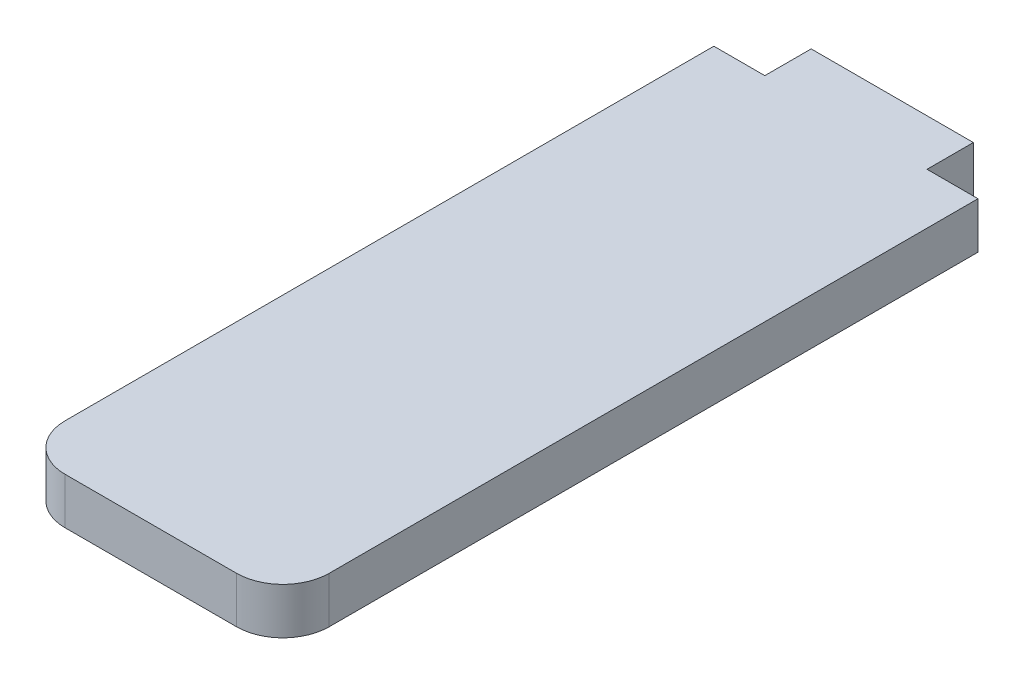
ISO-10303-21;
HEADER;
FILE_DESCRIPTION(('STEP AP214'),'2;1');
FILE_NAME('part.step','',(''),(''),'','','');
FILE_SCHEMA(('AUTOMOTIVE_DESIGN { 1 0 10303 214 1 1 1 1 }'));
ENDSEC;
DATA;
#1=APPLICATION_CONTEXT('core data for automotive mechanical design processes');
#2=APPLICATION_PROTOCOL_DEFINITION('international standard','automotive_design',2000,#1);
#3=PRODUCT_CONTEXT('',#1,'mechanical');
#4=PRODUCT('Part','Part','',(#3));
#5=PRODUCT_RELATED_PRODUCT_CATEGORY('part','',(#4));
#6=PRODUCT_DEFINITION_FORMATION('','',#4);
#7=PRODUCT_DEFINITION_CONTEXT('part definition',#1,'design');
#8=PRODUCT_DEFINITION('design','',#6,#7);
#9=PRODUCT_DEFINITION_SHAPE('','',#8);
#10=(LENGTH_UNIT() NAMED_UNIT(*) SI_UNIT(.MILLI.,.METRE.));
#11=(NAMED_UNIT(*) PLANE_ANGLE_UNIT() SI_UNIT($,.RADIAN.));
#12=(NAMED_UNIT(*) SI_UNIT($,.STERADIAN.) SOLID_ANGLE_UNIT());
#13=UNCERTAINTY_MEASURE_WITH_UNIT(LENGTH_MEASURE(1.E-05),#10,'distance_accuracy_value','');
#14=(GEOMETRIC_REPRESENTATION_CONTEXT(3) GLOBAL_UNCERTAINTY_ASSIGNED_CONTEXT((#13)) GLOBAL_UNIT_ASSIGNED_CONTEXT((#10,
#11,#12)) REPRESENTATION_CONTEXT('',''));
#15=CARTESIAN_POINT('',(0.,0.,0.));
#16=DIRECTION('',(0.,0.,1.));
#17=DIRECTION('',(1.,0.,0.));
#18=AXIS2_PLACEMENT_3D('',#15,#16,#17);
#19=CARTESIAN_POINT('',(8.75,5.,2.5));
#20=DIRECTION('',(-1.,0.,0.));
#21=DIRECTION('',(0.,0.,1.));
#22=AXIS2_PLACEMENT_3D('',#19,#20,#21);
#23=PLANE('',#22);
#24=DIRECTION('',(0.,0.,-1.));
#25=VECTOR('',#24,1.);
#26=CARTESIAN_POINT('',(8.75,0.,2.5));
#27=LINE('',#26,#25);
#28=CARTESIAN_POINT('',(8.75,0.,2.5));
#29=VERTEX_POINT('',#28);
#30=CARTESIAN_POINT('',(8.75,0.,-2.5));
#31=VERTEX_POINT('',#30);
#32=EDGE_CURVE('E141',#29,#31,#27,.T.);
#33=ORIENTED_EDGE('',*,*,#32,.T.);
#34=DIRECTION('',(0.,-1.,0.));
#35=VECTOR('',#34,1.);
#36=CARTESIAN_POINT('',(8.75,5.,-2.5));
#37=LINE('',#36,#35);
#38=CARTESIAN_POINT('',(8.75,5.,-2.5));
#39=VERTEX_POINT('',#38);
#40=EDGE_CURVE('E11',#39,#31,#37,.T.);
#41=ORIENTED_EDGE('',*,*,#40,.F.);
#42=DIRECTION('',(0.,0.,-1.));
#43=VECTOR('',#42,1.);
#44=CARTESIAN_POINT('',(8.75,5.,2.5));
#45=LINE('',#44,#43);
#46=CARTESIAN_POINT('',(8.75,5.,2.5));
#47=VERTEX_POINT('',#46);
#48=EDGE_CURVE('E159',#47,#39,#45,.T.);
#49=ORIENTED_EDGE('',*,*,#48,.F.);
#50=DIRECTION('',(0.,-1.,0.));
#51=VECTOR('',#50,1.);
#52=CARTESIAN_POINT('',(8.75,5.,2.5));
#53=LINE('',#52,#51);
#54=EDGE_CURVE('E137',#47,#29,#53,.T.);
#55=ORIENTED_EDGE('',*,*,#54,.T.);
#56=EDGE_LOOP('',(#33,#41,#49,#55));
#57=FACE_BOUND('',#56,.T.);
#58=ADVANCED_FACE('F33',(#57),#23,.F.);
#59=CARTESIAN_POINT('',(-8.75,5.,-2.5));
#60=DIRECTION('',(0.,0.,1.));
#61=DIRECTION('',(1.,0.,0.));
#62=AXIS2_PLACEMENT_3D('',#59,#60,#61);
#63=PLANE('',#62);
#64=DIRECTION('',(-1.,0.,0.));
#65=VECTOR('',#64,1.);
#66=CARTESIAN_POINT('',(-8.75,0.,-2.5));
#67=LINE('',#66,#65);
#68=CARTESIAN_POINT('',(-8.75,0.,-2.5));
#69=VERTEX_POINT('',#68);
#70=EDGE_CURVE('E144',#31,#69,#67,.T.);
#71=ORIENTED_EDGE('',*,*,#70,.T.);
#72=DIRECTION('',(0.,-1.,0.));
#73=VECTOR('',#72,1.);
#74=CARTESIAN_POINT('',(-8.75,5.,-2.5));
#75=LINE('',#74,#73);
#76=CARTESIAN_POINT('',(-8.75,5.,-2.5));
#77=VERTEX_POINT('',#76);
#78=EDGE_CURVE('E41',#77,#69,#75,.T.);
#79=ORIENTED_EDGE('',*,*,#78,.F.);
#80=DIRECTION('',(-1.,0.,0.));
#81=VECTOR('',#80,1.);
#82=CARTESIAN_POINT('',(-8.75,5.,-2.5));
#83=LINE('',#82,#81);
#84=EDGE_CURVE('E98',#39,#77,#83,.T.);
#85=ORIENTED_EDGE('',*,*,#84,.F.);
#86=ORIENTED_EDGE('',*,*,#40,.T.);
#87=EDGE_LOOP('',(#71,#79,#85,#86));
#88=FACE_BOUND('',#87,.T.);
#89=ADVANCED_FACE('F208',(#88),#63,.F.);
#90=CARTESIAN_POINT('',(-8.75,5.,2.5));
#91=DIRECTION('',(1.,0.,0.));
#92=DIRECTION('',(0.,0.,-1.));
#93=AXIS2_PLACEMENT_3D('',#90,#91,#92);
#94=PLANE('',#93);
#95=DIRECTION('',(0.,0.,1.));
#96=VECTOR('',#95,1.);
#97=CARTESIAN_POINT('',(-8.75,0.,2.5));
#98=LINE('',#97,#96);
#99=CARTESIAN_POINT('',(-8.75,0.,2.5));
#100=VERTEX_POINT('',#99);
#101=EDGE_CURVE('E146',#69,#100,#98,.T.);
#102=ORIENTED_EDGE('',*,*,#101,.T.);
#103=DIRECTION('',(0.,-1.,0.));
#104=VECTOR('',#103,1.);
#105=CARTESIAN_POINT('',(-8.75,5.,2.5));
#106=LINE('',#105,#104);
#107=CARTESIAN_POINT('',(-8.75,5.,2.5));
#108=VERTEX_POINT('',#107);
#109=EDGE_CURVE('E172',#108,#100,#106,.T.);
#110=ORIENTED_EDGE('',*,*,#109,.F.);
#111=DIRECTION('',(0.,0.,1.));
#112=VECTOR('',#111,1.);
#113=CARTESIAN_POINT('',(-8.75,5.,2.5));
#114=LINE('',#113,#112);
#115=EDGE_CURVE('E180',#77,#108,#114,.T.);
#116=ORIENTED_EDGE('',*,*,#115,.F.);
#117=ORIENTED_EDGE('',*,*,#78,.T.);
#118=EDGE_LOOP('',(#102,#110,#116,#117));
#119=FACE_BOUND('',#118,.T.);
#120=ADVANCED_FACE('F178',(#119),#94,.F.);
#121=CARTESIAN_POINT('',(-14.25,5.,2.5));
#122=DIRECTION('',(0.,0.,1.));
#123=DIRECTION('',(1.,0.,0.));
#124=AXIS2_PLACEMENT_3D('',#121,#122,#123);
#125=PLANE('',#124);
#126=DIRECTION('',(-1.,0.,0.));
#127=VECTOR('',#126,1.);
#128=CARTESIAN_POINT('',(-14.25,0.,2.5));
#129=LINE('',#128,#127);
#130=CARTESIAN_POINT('',(-14.25,0.,2.5));
#131=VERTEX_POINT('',#130);
#132=EDGE_CURVE('E148',#100,#131,#129,.T.);
#133=ORIENTED_EDGE('',*,*,#132,.T.);
#134=DIRECTION('',(0.,-1.,0.));
#135=VECTOR('',#134,1.);
#136=CARTESIAN_POINT('',(-14.25,5.,2.5));
#137=LINE('',#136,#135);
#138=CARTESIAN_POINT('',(-14.25,5.,2.5));
#139=VERTEX_POINT('',#138);
#140=EDGE_CURVE('E169',#139,#131,#137,.T.);
#141=ORIENTED_EDGE('',*,*,#140,.F.);
#142=DIRECTION('',(-1.,0.,0.));
#143=VECTOR('',#142,1.);
#144=CARTESIAN_POINT('',(-14.25,5.,2.5));
#145=LINE('',#144,#143);
#146=EDGE_CURVE('E198',#108,#139,#145,.T.);
#147=ORIENTED_EDGE('',*,*,#146,.F.);
#148=ORIENTED_EDGE('',*,*,#109,.T.);
#149=EDGE_LOOP('',(#133,#141,#147,#148));
#150=FACE_BOUND('',#149,.T.);
#151=ADVANCED_FACE('F189',(#150),#125,.F.);
#152=CARTESIAN_POINT('',(-14.25,5.,72.5));
#153=DIRECTION('',(1.,0.,0.));
#154=DIRECTION('',(0.,0.,-1.));
#155=AXIS2_PLACEMENT_3D('',#152,#153,#154);
#156=PLANE('',#155);
#157=DIRECTION('',(0.,0.,1.));
#158=VECTOR('',#157,1.);
#159=CARTESIAN_POINT('',(-14.25,0.,72.5));
#160=LINE('',#159,#158);
#161=CARTESIAN_POINT('',(-14.25,0.,72.5));
#162=VERTEX_POINT('',#161);
#163=EDGE_CURVE('E150',#131,#162,#160,.T.);
#164=ORIENTED_EDGE('',*,*,#163,.T.);
#165=DIRECTION('',(0.,-1.,0.));
#166=VECTOR('',#165,1.);
#167=CARTESIAN_POINT('',(-14.25,5.,72.5));
#168=LINE('',#167,#166);
#169=CARTESIAN_POINT('',(-14.25,5.,72.5));
#170=VERTEX_POINT('',#169);
#171=EDGE_CURVE('E166',#170,#162,#168,.T.);
#172=ORIENTED_EDGE('',*,*,#171,.F.);
#173=DIRECTION('',(0.,0.,1.));
#174=VECTOR('',#173,1.);
#175=CARTESIAN_POINT('',(-14.25,5.,72.5));
#176=LINE('',#175,#174);
#177=EDGE_CURVE('E195',#139,#170,#176,.T.);
#178=ORIENTED_EDGE('',*,*,#177,.F.);
#179=ORIENTED_EDGE('',*,*,#140,.T.);
#180=EDGE_LOOP('',(#164,#172,#178,#179));
#181=FACE_BOUND('',#180,.T.);
#182=ADVANCED_FACE('F193',(#181),#156,.F.);
#183=CARTESIAN_POINT('',(-9.25,5.,72.5));
#184=DIRECTION('',(0.,-1.,0.));
#185=DIRECTION('',(0.,0.,-1.));
#186=AXIS2_PLACEMENT_3D('',#183,#184,#185);
#187=CYLINDRICAL_SURFACE('',#186,5.);
#188=CARTESIAN_POINT('',(-9.25,0.,72.5));
#189=DIRECTION('',(0.,1.,0.));
#190=DIRECTION('',(0.,0.,-1.));
#191=AXIS2_PLACEMENT_3D('',#188,#189,#190);
#192=CIRCLE('',#191,5.);
#193=CARTESIAN_POINT('',(-9.24999999999997,0.,77.5));
#194=VERTEX_POINT('',#193);
#195=EDGE_CURVE('E152',#162,#194,#192,.T.);
#196=ORIENTED_EDGE('',*,*,#195,.T.);
#197=DIRECTION('',(0.,-1.,0.));
#198=VECTOR('',#197,1.);
#199=CARTESIAN_POINT('',(-9.24999999999997,5.,77.5));
#200=LINE('',#199,#198);
#201=CARTESIAN_POINT('',(-9.24999999999997,5.,77.5));
#202=VERTEX_POINT('',#201);
#203=EDGE_CURVE('E163',#202,#194,#200,.T.);
#204=ORIENTED_EDGE('',*,*,#203,.F.);
#205=CARTESIAN_POINT('',(-9.25,5.,72.5));
#206=DIRECTION('',(0.,1.,0.));
#207=DIRECTION('',(0.,0.,-1.));
#208=AXIS2_PLACEMENT_3D('',#205,#206,#207);
#209=CIRCLE('',#208,5.);
#210=EDGE_CURVE('E197',#170,#202,#209,.T.);
#211=ORIENTED_EDGE('',*,*,#210,.F.);
#212=ORIENTED_EDGE('',*,*,#171,.T.);
#213=EDGE_LOOP('',(#196,#204,#211,#212));
#214=FACE_BOUND('',#213,.T.);
#215=ADVANCED_FACE('F220',(#214),#187,.T.);
#216=CARTESIAN_POINT('',(-9.24999999999997,5.,77.5));
#217=DIRECTION('',(0.,0.,-1.));
#218=DIRECTION('',(-1.,0.,0.));
#219=AXIS2_PLACEMENT_3D('',#216,#217,#218);
#220=PLANE('',#219);
#221=DIRECTION('',(1.,0.,0.));
#222=VECTOR('',#221,1.);
#223=CARTESIAN_POINT('',(-9.24999999999997,0.,77.5));
#224=LINE('',#223,#222);
#225=CARTESIAN_POINT('',(9.24999999999996,0.,77.5));
#226=VERTEX_POINT('',#225);
#227=EDGE_CURVE('E154',#194,#226,#224,.T.);
#228=ORIENTED_EDGE('',*,*,#227,.T.);
#229=DIRECTION('',(0.,-1.,0.));
#230=VECTOR('',#229,1.);
#231=CARTESIAN_POINT('',(9.24999999999996,5.,77.5));
#232=LINE('',#231,#230);
#233=CARTESIAN_POINT('',(9.24999999999996,5.,77.5));
#234=VERTEX_POINT('',#233);
#235=EDGE_CURVE('E132',#234,#226,#232,.T.);
#236=ORIENTED_EDGE('',*,*,#235,.F.);
#237=DIRECTION('',(1.,0.,0.));
#238=VECTOR('',#237,1.);
#239=CARTESIAN_POINT('',(-9.24999999999997,5.,77.5));
#240=LINE('',#239,#238);
#241=EDGE_CURVE('E123',#202,#234,#240,.T.);
#242=ORIENTED_EDGE('',*,*,#241,.F.);
#243=ORIENTED_EDGE('',*,*,#203,.T.);
#244=EDGE_LOOP('',(#228,#236,#242,#243));
#245=FACE_BOUND('',#244,.T.);
#246=ADVANCED_FACE('F223',(#245),#220,.F.);
#247=CARTESIAN_POINT('',(9.25,5.,72.5));
#248=DIRECTION('',(0.,-1.,0.));
#249=DIRECTION('',(0.,0.,-1.));
#250=AXIS2_PLACEMENT_3D('',#247,#248,#249);
#251=CYLINDRICAL_SURFACE('',#250,5.);
#252=CARTESIAN_POINT('',(9.25,0.,72.5));
#253=DIRECTION('',(0.,1.,0.));
#254=DIRECTION('',(0.,0.,1.));
#255=AXIS2_PLACEMENT_3D('',#252,#253,#254);
#256=CIRCLE('',#255,5.);
#257=CARTESIAN_POINT('',(14.25,0.,72.5));
#258=VERTEX_POINT('',#257);
#259=EDGE_CURVE('E131',#226,#258,#256,.T.);
#260=ORIENTED_EDGE('',*,*,#259,.T.);
#261=DIRECTION('',(0.,-1.,0.));
#262=VECTOR('',#261,1.);
#263=CARTESIAN_POINT('',(14.25,5.,72.5));
#264=LINE('',#263,#262);
#265=CARTESIAN_POINT('',(14.25,5.,72.5));
#266=VERTEX_POINT('',#265);
#267=EDGE_CURVE('E128',#266,#258,#264,.T.);
#268=ORIENTED_EDGE('',*,*,#267,.F.);
#269=CARTESIAN_POINT('',(9.25,5.,72.5));
#270=DIRECTION('',(0.,1.,0.));
#271=DIRECTION('',(0.,0.,1.));
#272=AXIS2_PLACEMENT_3D('',#269,#270,#271);
#273=CIRCLE('',#272,5.);
#274=EDGE_CURVE('E117',#234,#266,#273,.T.);
#275=ORIENTED_EDGE('',*,*,#274,.F.);
#276=ORIENTED_EDGE('',*,*,#235,.T.);
#277=EDGE_LOOP('',(#260,#268,#275,#276));
#278=FACE_BOUND('',#277,.T.);
#279=ADVANCED_FACE('F129',(#278),#251,.T.);
#280=CARTESIAN_POINT('',(14.25,5.,72.5));
#281=DIRECTION('',(-1.,0.,0.));
#282=DIRECTION('',(0.,0.,1.));
#283=AXIS2_PLACEMENT_3D('',#280,#281,#282);
#284=PLANE('',#283);
#285=DIRECTION('',(0.,0.,-1.));
#286=VECTOR('',#285,1.);
#287=CARTESIAN_POINT('',(14.25,0.,72.5));
#288=LINE('',#287,#286);
#289=CARTESIAN_POINT('',(14.25,0.,2.5));
#290=VERTEX_POINT('',#289);
#291=EDGE_CURVE('E84',#258,#290,#288,.T.);
#292=ORIENTED_EDGE('',*,*,#291,.T.);
#293=DIRECTION('',(0.,-1.,0.));
#294=VECTOR('',#293,1.);
#295=CARTESIAN_POINT('',(14.25,5.,2.5));
#296=LINE('',#295,#294);
#297=CARTESIAN_POINT('',(14.25,5.,2.5));
#298=VERTEX_POINT('',#297);
#299=EDGE_CURVE('E133',#298,#290,#296,.T.);
#300=ORIENTED_EDGE('',*,*,#299,.F.);
#301=DIRECTION('',(0.,0.,-1.));
#302=VECTOR('',#301,1.);
#303=CARTESIAN_POINT('',(14.25,5.,72.5));
#304=LINE('',#303,#302);
#305=EDGE_CURVE('E121',#266,#298,#304,.T.);
#306=ORIENTED_EDGE('',*,*,#305,.F.);
#307=ORIENTED_EDGE('',*,*,#267,.T.);
#308=EDGE_LOOP('',(#292,#300,#306,#307));
#309=FACE_BOUND('',#308,.T.);
#310=ADVANCED_FACE('F135',(#309),#284,.F.);
#311=CARTESIAN_POINT('',(8.75,5.,2.5));
#312=DIRECTION('',(0.,0.,1.));
#313=DIRECTION('',(1.,0.,0.));
#314=AXIS2_PLACEMENT_3D('',#311,#312,#313);
#315=PLANE('',#314);
#316=DIRECTION('',(-1.,0.,0.));
#317=VECTOR('',#316,1.);
#318=CARTESIAN_POINT('',(8.75,0.,2.5));
#319=LINE('',#318,#317);
#320=EDGE_CURVE('E90',#290,#29,#319,.T.);
#321=ORIENTED_EDGE('',*,*,#320,.T.);
#322=ORIENTED_EDGE('',*,*,#54,.F.);
#323=DIRECTION('',(-1.,0.,0.));
#324=VECTOR('',#323,1.);
#325=CARTESIAN_POINT('',(8.75,5.,2.5));
#326=LINE('',#325,#324);
#327=EDGE_CURVE('E49',#298,#47,#326,.T.);
#328=ORIENTED_EDGE('',*,*,#327,.F.);
#329=ORIENTED_EDGE('',*,*,#299,.T.);
#330=EDGE_LOOP('',(#321,#322,#328,#329));
#331=FACE_BOUND('',#330,.T.);
#332=ADVANCED_FACE('F232',(#331),#315,.F.);
#333=CARTESIAN_POINT('',(-9.25,5.,72.5));
#334=DIRECTION('',(0.,-1.,0.));
#335=DIRECTION('',(0.,0.,-1.));
#336=AXIS2_PLACEMENT_3D('',#333,#334,#335);
#337=PLANE('',#336);
#338=ORIENTED_EDGE('',*,*,#48,.T.);
#339=ORIENTED_EDGE('',*,*,#84,.T.);
#340=ORIENTED_EDGE('',*,*,#115,.T.);
#341=ORIENTED_EDGE('',*,*,#146,.T.);
#342=ORIENTED_EDGE('',*,*,#177,.T.);
#343=ORIENTED_EDGE('',*,*,#210,.T.);
#344=ORIENTED_EDGE('',*,*,#241,.T.);
#345=ORIENTED_EDGE('',*,*,#274,.T.);
#346=ORIENTED_EDGE('',*,*,#305,.T.);
#347=ORIENTED_EDGE('',*,*,#327,.T.);
#348=EDGE_LOOP('',(#338,#339,#340,#341,#342,#343,#344,#345,#346,#347));
#349=FACE_BOUND('',#348,.T.);
#350=ADVANCED_FACE('F119',(#349),#337,.F.);
#351=CARTESIAN_POINT('',(-9.25,0.,72.5));
#352=DIRECTION('',(0.,-1.,0.));
#353=DIRECTION('',(0.,0.,-1.));
#354=AXIS2_PLACEMENT_3D('',#351,#352,#353);
#355=PLANE('',#354);
#356=ORIENTED_EDGE('',*,*,#32,.F.);
#357=ORIENTED_EDGE('',*,*,#320,.F.);
#358=ORIENTED_EDGE('',*,*,#291,.F.);
#359=ORIENTED_EDGE('',*,*,#259,.F.);
#360=ORIENTED_EDGE('',*,*,#227,.F.);
#361=ORIENTED_EDGE('',*,*,#195,.F.);
#362=ORIENTED_EDGE('',*,*,#163,.F.);
#363=ORIENTED_EDGE('',*,*,#132,.F.);
#364=ORIENTED_EDGE('',*,*,#101,.F.);
#365=ORIENTED_EDGE('',*,*,#70,.F.);
#366=EDGE_LOOP('',(#356,#357,#358,#359,#360,#361,#362,#363,#364,#365));
#367=FACE_BOUND('',#366,.T.);
#368=ADVANCED_FACE('F184',(#367),#355,.T.);
#369=CLOSED_SHELL('',(#58,#89,#120,#151,#182,#215,#246,#279,#310,#332,#350,#368));
#370=MANIFOLD_SOLID_BREP('B2',#369);
#371=ADVANCED_BREP_SHAPE_REPRESENTATION('',(#18,#370),#14);
#372=SHAPE_DEFINITION_REPRESENTATION(#9,#371);
ENDSEC;
END-ISO-10303-21;
